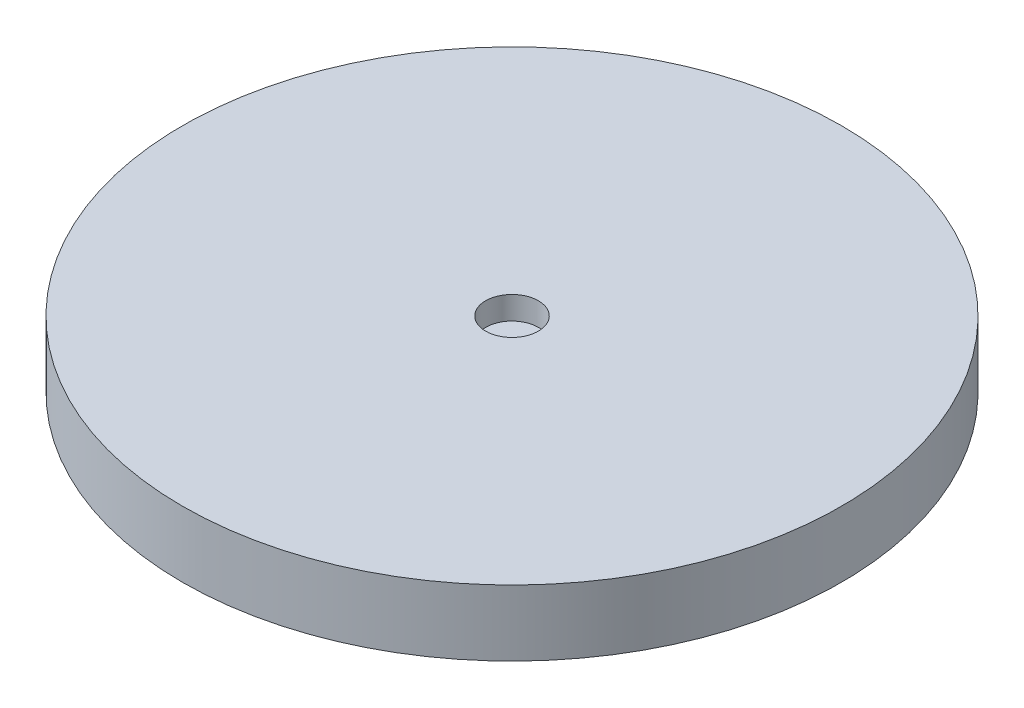
ISO-10303-21;
HEADER;
FILE_DESCRIPTION(('STEP AP214'),'2;1');
FILE_NAME('part.step','',(''),(''),'','','');
FILE_SCHEMA(('AUTOMOTIVE_DESIGN { 1 0 10303 214 1 1 1 1 }'));
ENDSEC;
DATA;
#1=APPLICATION_CONTEXT('core data for automotive mechanical design processes');
#2=APPLICATION_PROTOCOL_DEFINITION('international standard','automotive_design',2000,#1);
#3=PRODUCT_CONTEXT('',#1,'mechanical');
#4=PRODUCT('Part','Part','',(#3));
#5=PRODUCT_RELATED_PRODUCT_CATEGORY('part','',(#4));
#6=PRODUCT_DEFINITION_FORMATION('','',#4);
#7=PRODUCT_DEFINITION_CONTEXT('part definition',#1,'design');
#8=PRODUCT_DEFINITION('design','',#6,#7);
#9=PRODUCT_DEFINITION_SHAPE('','',#8);
#10=(LENGTH_UNIT() NAMED_UNIT(*) SI_UNIT(.MILLI.,.METRE.));
#11=(NAMED_UNIT(*) PLANE_ANGLE_UNIT() SI_UNIT($,.RADIAN.));
#12=(NAMED_UNIT(*) SI_UNIT($,.STERADIAN.) SOLID_ANGLE_UNIT());
#13=UNCERTAINTY_MEASURE_WITH_UNIT(LENGTH_MEASURE(1.E-05),#10,'distance_accuracy_value','');
#14=(GEOMETRIC_REPRESENTATION_CONTEXT(3) GLOBAL_UNCERTAINTY_ASSIGNED_CONTEXT((#13)) GLOBAL_UNIT_ASSIGNED_CONTEXT((#10,
#11,#12)) REPRESENTATION_CONTEXT('',''));
#15=CARTESIAN_POINT('',(0.,0.,0.));
#16=DIRECTION('',(0.,0.,1.));
#17=DIRECTION('',(1.,0.,0.));
#18=AXIS2_PLACEMENT_3D('',#15,#16,#17);
#19=CARTESIAN_POINT('',(0.,10.,0.));
#20=DIRECTION('',(0.,-1.,0.));
#21=DIRECTION('',(0.,0.,-1.));
#22=AXIS2_PLACEMENT_3D('',#19,#20,#21);
#23=CYLINDRICAL_SURFACE('',#22,50.);
#24=CARTESIAN_POINT('',(0.,10.,0.));
#25=DIRECTION('',(0.,1.,0.));
#26=DIRECTION('',(0.,0.,1.));
#27=AXIS2_PLACEMENT_3D('',#24,#25,#26);
#28=CIRCLE('',#27,50.);
#29=CARTESIAN_POINT('',(0.,10.,50.));
#30=VERTEX_POINT('',#29);
#31=EDGE_CURVE('E10',#30,#30,#28,.T.);
#32=ORIENTED_EDGE('',*,*,#31,.F.);
#33=EDGE_LOOP('',(#32));
#34=FACE_BOUND('',#33,.T.);
#35=CARTESIAN_POINT('',(0.,0.,0.));
#36=DIRECTION('',(0.,1.,0.));
#37=DIRECTION('',(0.,0.,1.));
#38=AXIS2_PLACEMENT_3D('',#35,#36,#37);
#39=CIRCLE('',#38,50.);
#40=CARTESIAN_POINT('',(0.,0.,50.));
#41=VERTEX_POINT('',#40);
#42=EDGE_CURVE('E34',#41,#41,#39,.T.);
#43=ORIENTED_EDGE('',*,*,#42,.T.);
#44=EDGE_LOOP('',(#43));
#45=FACE_BOUND('',#44,.T.);
#46=ADVANCED_FACE('F31',(#34,#45),#23,.T.);
#47=CARTESIAN_POINT('',(0.,10.,0.));
#48=DIRECTION('',(0.,1.,0.));
#49=DIRECTION('',(0.,0.,1.));
#50=AXIS2_PLACEMENT_3D('',#47,#48,#49);
#51=PLANE('',#50);
#52=CARTESIAN_POINT('',(0.,10.,0.));
#53=DIRECTION('',(0.,1.,0.));
#54=DIRECTION('',(0.,0.,1.));
#55=AXIS2_PLACEMENT_3D('',#52,#53,#54);
#56=CIRCLE('',#55,4.);
#57=CARTESIAN_POINT('',(0.,10.,4.));
#58=VERTEX_POINT('',#57);
#59=EDGE_CURVE('E43',#58,#58,#56,.T.);
#60=ORIENTED_EDGE('',*,*,#59,.F.);
#61=EDGE_LOOP('',(#60));
#62=FACE_BOUND('',#61,.T.);
#63=ORIENTED_EDGE('',*,*,#31,.T.);
#64=EDGE_LOOP('',(#63));
#65=FACE_BOUND('',#64,.T.);
#66=ADVANCED_FACE('F58',(#62,#65),#51,.T.);
#67=CARTESIAN_POINT('',(0.,0.,0.));
#68=DIRECTION('',(0.,1.,0.));
#69=DIRECTION('',(0.,0.,1.));
#70=AXIS2_PLACEMENT_3D('',#67,#68,#69);
#71=PLANE('',#70);
#72=ORIENTED_EDGE('',*,*,#42,.F.);
#73=EDGE_LOOP('',(#72));
#74=FACE_BOUND('',#73,.T.);
#75=ADVANCED_FACE('F54',(#74),#71,.F.);
#76=CARTESIAN_POINT('',(0.,6.5,0.));
#77=DIRECTION('',(0.,1.,0.));
#78=DIRECTION('',(0.,0.,1.));
#79=AXIS2_PLACEMENT_3D('',#76,#77,#78);
#80=CYLINDRICAL_SURFACE('',#79,4.);
#81=CARTESIAN_POINT('',(0.,6.5,0.));
#82=DIRECTION('',(0.,1.,0.));
#83=DIRECTION('',(0.,0.,1.));
#84=AXIS2_PLACEMENT_3D('',#81,#82,#83);
#85=CIRCLE('',#84,4.);
#86=CARTESIAN_POINT('',(0.,6.5,4.));
#87=VERTEX_POINT('',#86);
#88=EDGE_CURVE('E41',#87,#87,#85,.T.);
#89=ORIENTED_EDGE('',*,*,#88,.F.);
#90=EDGE_LOOP('',(#89));
#91=FACE_BOUND('',#90,.T.);
#92=ORIENTED_EDGE('',*,*,#59,.T.);
#93=EDGE_LOOP('',(#92));
#94=FACE_BOUND('',#93,.T.);
#95=ADVANCED_FACE('F51',(#91,#94),#80,.F.);
#96=CARTESIAN_POINT('',(0.,6.5,0.));
#97=DIRECTION('',(0.,1.,0.));
#98=DIRECTION('',(0.,0.,1.));
#99=AXIS2_PLACEMENT_3D('',#96,#97,#98);
#100=PLANE('',#99);
#101=ORIENTED_EDGE('',*,*,#88,.T.);
#102=EDGE_LOOP('',(#101));
#103=FACE_BOUND('',#102,.T.);
#104=ADVANCED_FACE('F49',(#103),#100,.T.);
#105=CLOSED_SHELL('',(#46,#66,#75,#95,#104));
#106=MANIFOLD_SOLID_BREP('B2',#105);
#107=ADVANCED_BREP_SHAPE_REPRESENTATION('',(#18,#106),#14);
#108=SHAPE_DEFINITION_REPRESENTATION(#9,#107);
ENDSEC;
END-ISO-10303-21;
